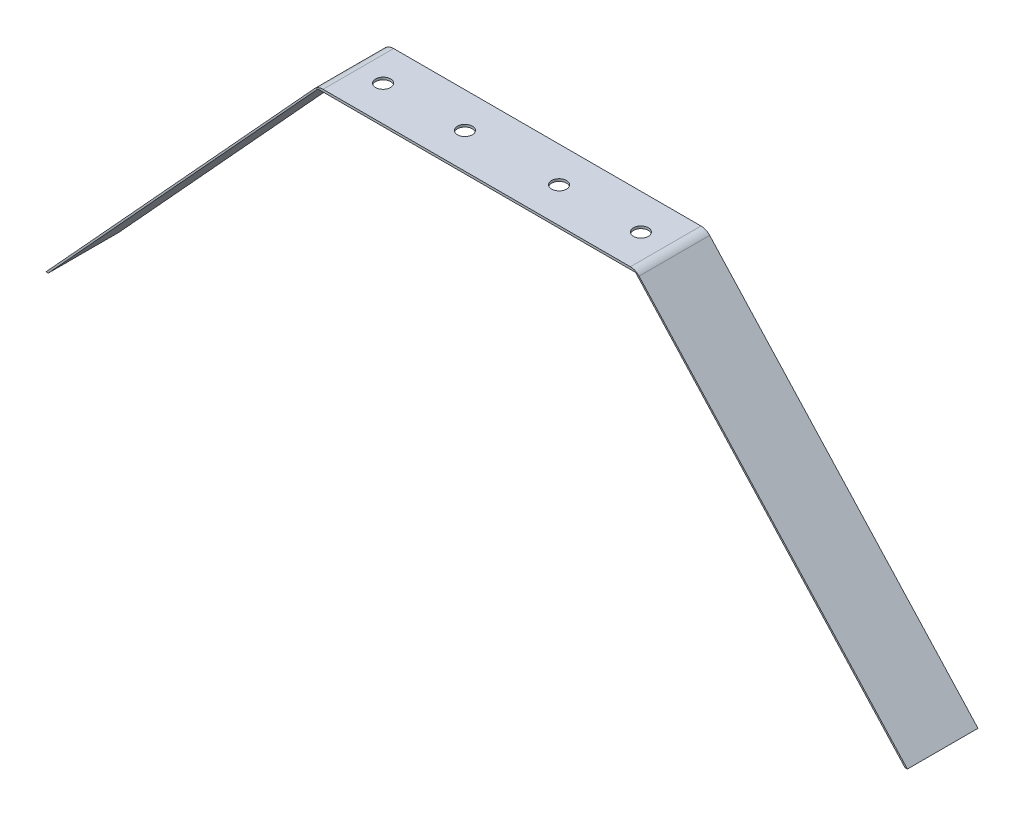
ISO-10303-21;
HEADER;
FILE_DESCRIPTION(('STEP AP214'),'2;1');
FILE_NAME('part.step','',(''),(''),'','','');
FILE_SCHEMA(('AUTOMOTIVE_DESIGN { 1 0 10303 214 1 1 1 1 }'));
ENDSEC;
DATA;
#1=APPLICATION_CONTEXT('core data for automotive mechanical design processes');
#2=APPLICATION_PROTOCOL_DEFINITION('international standard','automotive_design',2000,#1);
#3=PRODUCT_CONTEXT('',#1,'mechanical');
#4=PRODUCT('Part','Part','',(#3));
#5=PRODUCT_RELATED_PRODUCT_CATEGORY('part','',(#4));
#6=PRODUCT_DEFINITION_FORMATION('','',#4);
#7=PRODUCT_DEFINITION_CONTEXT('part definition',#1,'design');
#8=PRODUCT_DEFINITION('design','',#6,#7);
#9=PRODUCT_DEFINITION_SHAPE('','',#8);
#10=(LENGTH_UNIT() NAMED_UNIT(*) SI_UNIT(.MILLI.,.METRE.));
#11=(NAMED_UNIT(*) PLANE_ANGLE_UNIT() SI_UNIT($,.RADIAN.));
#12=(NAMED_UNIT(*) SI_UNIT($,.STERADIAN.) SOLID_ANGLE_UNIT());
#13=UNCERTAINTY_MEASURE_WITH_UNIT(LENGTH_MEASURE(1.E-05),#10,'distance_accuracy_value','');
#14=(GEOMETRIC_REPRESENTATION_CONTEXT(3) GLOBAL_UNCERTAINTY_ASSIGNED_CONTEXT((#13)) GLOBAL_UNIT_ASSIGNED_CONTEXT((#10,
#11,#12)) REPRESENTATION_CONTEXT('',''));
#15=CARTESIAN_POINT('',(0.,0.,0.));
#16=DIRECTION('',(0.,0.,1.));
#17=DIRECTION('',(1.,0.,0.));
#18=AXIS2_PLACEMENT_3D('',#15,#16,#17);
#19=CARTESIAN_POINT('',(-205.,97.5,30.));
#20=DIRECTION('',(0.,-1.,0.));
#21=DIRECTION('',(0.,0.,-1.));
#22=AXIS2_PLACEMENT_3D('',#19,#20,#21);
#23=PLANE('',#22);
#24=CARTESIAN_POINT('',(-54.768749878,97.5,15.));
#25=DIRECTION('',(0.,1.,0.));
#26=DIRECTION('',(0.,0.,1.));
#27=AXIS2_PLACEMENT_3D('',#24,#25,#26);
#28=CIRCLE('',#27,3.175);
#29=CARTESIAN_POINT('',(-54.768749878,97.5,18.175));
#30=VERTEX_POINT('',#29);
#31=EDGE_CURVE('E210',#30,#30,#28,.T.);
#32=ORIENTED_EDGE('',*,*,#31,.F.);
#33=EDGE_LOOP('',(#32));
#34=FACE_BOUND('',#33,.T.);
#35=CARTESIAN_POINT('',(54.768750122,97.5,15.));
#36=DIRECTION('',(0.,1.,0.));
#37=DIRECTION('',(0.,0.,1.));
#38=AXIS2_PLACEMENT_3D('',#35,#36,#37);
#39=CIRCLE('',#38,3.17499999999998);
#40=CARTESIAN_POINT('',(54.768750122,97.5,18.175));
#41=VERTEX_POINT('',#40);
#42=EDGE_CURVE('E213',#41,#41,#39,.T.);
#43=ORIENTED_EDGE('',*,*,#42,.F.);
#44=EDGE_LOOP('',(#43));
#45=FACE_BOUND('',#44,.T.);
#46=CARTESIAN_POINT('',(20.,97.5,15.));
#47=DIRECTION('',(0.,1.,0.));
#48=DIRECTION('',(0.,0.,1.));
#49=AXIS2_PLACEMENT_3D('',#46,#47,#48);
#50=CIRCLE('',#49,3.17499999999998);
#51=CARTESIAN_POINT('',(20.,97.5,18.175));
#52=VERTEX_POINT('',#51);
#53=EDGE_CURVE('E209',#52,#52,#50,.T.);
#54=ORIENTED_EDGE('',*,*,#53,.F.);
#55=EDGE_LOOP('',(#54));
#56=FACE_BOUND('',#55,.T.);
#57=CARTESIAN_POINT('',(-20.,97.5,15.));
#58=DIRECTION('',(0.,1.,0.));
#59=DIRECTION('',(0.,0.,1.));
#60=AXIS2_PLACEMENT_3D('',#57,#58,#59);
#61=CIRCLE('',#60,3.175);
#62=CARTESIAN_POINT('',(-20.,97.5,18.175));
#63=VERTEX_POINT('',#62);
#64=EDGE_CURVE('E170',#63,#63,#61,.T.);
#65=ORIENTED_EDGE('',*,*,#64,.F.);
#66=EDGE_LOOP('',(#65));
#67=FACE_BOUND('',#66,.T.);
#68=DIRECTION('',(-1.,0.,0.));
#69=VECTOR('',#68,1.);
#70=CARTESIAN_POINT('',(-205.,97.5,30.));
#71=LINE('',#70,#69);
#72=CARTESIAN_POINT('',(65.3004914182918,97.5,30.));
#73=VERTEX_POINT('',#72);
#74=CARTESIAN_POINT('',(-65.3004914182918,97.5,30.));
#75=VERTEX_POINT('',#74);
#76=EDGE_CURVE('E145',#73,#75,#71,.T.);
#77=ORIENTED_EDGE('',*,*,#76,.F.);
#78=DIRECTION('',(0.,0.,1.));
#79=VECTOR('',#78,1.);
#80=CARTESIAN_POINT('',(65.3004914182918,97.5,0.));
#81=LINE('',#80,#79);
#82=CARTESIAN_POINT('',(65.3004914182918,97.5,0.));
#83=VERTEX_POINT('',#82);
#84=EDGE_CURVE('E162',#73,#83,#81,.F.);
#85=ORIENTED_EDGE('',*,*,#84,.T.);
#86=DIRECTION('',(-1.,0.,0.));
#87=VECTOR('',#86,1.);
#88=CARTESIAN_POINT('',(-205.,97.5,0.));
#89=LINE('',#88,#87);
#90=CARTESIAN_POINT('',(-65.3004914182918,97.5,0.));
#91=VERTEX_POINT('',#90);
#92=EDGE_CURVE('E137',#83,#91,#89,.T.);
#93=ORIENTED_EDGE('',*,*,#92,.T.);
#94=DIRECTION('',(0.,0.,1.));
#95=VECTOR('',#94,1.);
#96=CARTESIAN_POINT('',(-65.3004914182918,97.5,30.));
#97=LINE('',#96,#95);
#98=EDGE_CURVE('E147',#91,#75,#97,.T.);
#99=ORIENTED_EDGE('',*,*,#98,.T.);
#100=EDGE_LOOP('',(#77,#85,#93,#99));
#101=FACE_BOUND('',#100,.T.);
#102=ADVANCED_FACE('F38',(#34,#45,#56,#67,#101),#23,.F.);
#103=CARTESIAN_POINT('',(0.,0.,30.));
#104=DIRECTION('',(0.,0.,1.));
#105=DIRECTION('',(1.,0.,0.));
#106=AXIS2_PLACEMENT_3D('',#103,#104,#105);
#107=PLANE('',#106);
#108=DIRECTION('',(1.,0.,0.));
#109=VECTOR('',#108,1.);
#110=CARTESIAN_POINT('',(-210.,-28.5,30.));
#111=LINE('',#110,#109);
#112=CARTESIAN_POINT('',(182.013422818792,-28.5,30.));
#113=VERTEX_POINT('',#112);
#114=CARTESIAN_POINT('',(183.,-28.5,30.));
#115=VERTEX_POINT('',#114);
#116=EDGE_CURVE('E61',#113,#115,#111,.T.);
#117=ORIENTED_EDGE('',*,*,#116,.T.);
#118=DIRECTION('',(-0.675724628517346,0.737154140200742,0.));
#119=VECTOR('',#118,1.);
#120=CARTESIAN_POINT('',(85.245283018868,78.1415094339622,30.));
#121=LINE('',#120,#119);
#122=CARTESIAN_POINT('',(68.9862621192955,95.8786231425867,30.));
#123=VERTEX_POINT('',#122);
#124=EDGE_CURVE('E139',#115,#123,#121,.T.);
#125=ORIENTED_EDGE('',*,*,#124,.T.);
#126=CARTESIAN_POINT('',(65.3004914182918,92.5,30.));
#127=DIRECTION('',(0.,0.,1.));
#128=DIRECTION('',(1.,0.,0.));
#129=AXIS2_PLACEMENT_3D('',#126,#127,#128);
#130=CIRCLE('',#129,5.);
#131=EDGE_CURVE('E160',#123,#73,#130,.T.);
#132=ORIENTED_EDGE('',*,*,#131,.T.);
#133=ORIENTED_EDGE('',*,*,#76,.T.);
#134=CARTESIAN_POINT('',(-65.3004914182918,92.5,30.));
#135=DIRECTION('',(0.,0.,1.));
#136=DIRECTION('',(1.,0.,0.));
#137=AXIS2_PLACEMENT_3D('',#134,#135,#136);
#138=CIRCLE('',#137,5.);
#139=CARTESIAN_POINT('',(-68.9862621192955,95.8786231425867,30.));
#140=VERTEX_POINT('',#139);
#141=EDGE_CURVE('E133',#75,#140,#138,.T.);
#142=ORIENTED_EDGE('',*,*,#141,.T.);
#143=DIRECTION('',(0.675724628517346,0.737154140200742,0.));
#144=VECTOR('',#143,1.);
#145=CARTESIAN_POINT('',(-85.2452830188679,78.1415094339623,30.));
#146=LINE('',#145,#144);
#147=CARTESIAN_POINT('',(-183.,-28.5,30.));
#148=VERTEX_POINT('',#147);
#149=EDGE_CURVE('E126',#148,#140,#146,.T.);
#150=ORIENTED_EDGE('',*,*,#149,.F.);
#151=CARTESIAN_POINT('',(-182.013422818792,-28.5,30.));
#152=VERTEX_POINT('',#151);
#153=EDGE_CURVE('E112',#148,#152,#111,.T.);
#154=ORIENTED_EDGE('',*,*,#153,.T.);
#155=DIRECTION('',(0.675500504238443,0.737359524773099,0.));
#156=VECTOR('',#155,1.);
#157=CARTESIAN_POINT('',(-84.7650566633809,77.6538941916208,30.));
#158=LINE('',#157,#156);
#159=CARTESIAN_POINT('',(-67.5,96.5,30.));
#160=VERTEX_POINT('',#159);
#161=EDGE_CURVE('E187',#152,#160,#158,.T.);
#162=ORIENTED_EDGE('',*,*,#161,.T.);
#163=DIRECTION('',(1.,0.,0.));
#164=VECTOR('',#163,1.);
#165=CARTESIAN_POINT('',(0.,96.5,30.));
#166=LINE('',#165,#164);
#167=CARTESIAN_POINT('',(67.5,96.5,30.));
#168=VERTEX_POINT('',#167);
#169=EDGE_CURVE('E180',#160,#168,#166,.T.);
#170=ORIENTED_EDGE('',*,*,#169,.T.);
#171=DIRECTION('',(-0.675500504238443,0.737359524773099,0.));
#172=VECTOR('',#171,1.);
#173=CARTESIAN_POINT('',(84.7650566633809,77.6538941916208,30.));
#174=LINE('',#173,#172);
#175=EDGE_CURVE('E177',#113,#168,#174,.T.);
#176=ORIENTED_EDGE('',*,*,#175,.F.);
#177=EDGE_LOOP('',(#117,#125,#132,#133,#142,#150,#154,#162,#170,#176));
#178=FACE_BOUND('',#177,.T.);
#179=ADVANCED_FACE('F131',(#178),#107,.T.);
#180=CARTESIAN_POINT('',(0.,0.,0.));
#181=DIRECTION('',(0.,0.,1.));
#182=DIRECTION('',(1.,0.,0.));
#183=AXIS2_PLACEMENT_3D('',#180,#181,#182);
#184=PLANE('',#183);
#185=DIRECTION('',(-0.675724628517346,0.737154140200742,0.));
#186=VECTOR('',#185,1.);
#187=CARTESIAN_POINT('',(85.245283018868,78.1415094339622,0.));
#188=LINE('',#187,#186);
#189=CARTESIAN_POINT('',(183.,-28.5,0.));
#190=VERTEX_POINT('',#189);
#191=CARTESIAN_POINT('',(68.9862621192955,95.8786231425867,0.));
#192=VERTEX_POINT('',#191);
#193=EDGE_CURVE('E135',#190,#192,#188,.T.);
#194=ORIENTED_EDGE('',*,*,#193,.F.);
#195=DIRECTION('',(1.,0.,0.));
#196=VECTOR('',#195,1.);
#197=CARTESIAN_POINT('',(-210.,-28.5,0.));
#198=LINE('',#197,#196);
#199=CARTESIAN_POINT('',(182.013422818792,-28.5,0.));
#200=VERTEX_POINT('',#199);
#201=EDGE_CURVE('E120',#200,#190,#198,.T.);
#202=ORIENTED_EDGE('',*,*,#201,.F.);
#203=DIRECTION('',(-0.675500504238443,0.737359524773099,0.));
#204=VECTOR('',#203,1.);
#205=CARTESIAN_POINT('',(84.7650566633809,77.6538941916208,0.));
#206=LINE('',#205,#204);
#207=CARTESIAN_POINT('',(67.5,96.5,0.));
#208=VERTEX_POINT('',#207);
#209=EDGE_CURVE('E194',#200,#208,#206,.T.);
#210=ORIENTED_EDGE('',*,*,#209,.T.);
#211=DIRECTION('',(1.,0.,0.));
#212=VECTOR('',#211,1.);
#213=CARTESIAN_POINT('',(0.,96.5,0.));
#214=LINE('',#213,#212);
#215=CARTESIAN_POINT('',(-67.5,96.5,0.));
#216=VERTEX_POINT('',#215);
#217=EDGE_CURVE('E200',#216,#208,#214,.T.);
#218=ORIENTED_EDGE('',*,*,#217,.F.);
#219=DIRECTION('',(0.675500504238443,0.737359524773099,0.));
#220=VECTOR('',#219,1.);
#221=CARTESIAN_POINT('',(-84.7650566633809,77.6538941916208,0.));
#222=LINE('',#221,#220);
#223=CARTESIAN_POINT('',(-182.013422818792,-28.5,0.));
#224=VERTEX_POINT('',#223);
#225=EDGE_CURVE('E190',#224,#216,#222,.T.);
#226=ORIENTED_EDGE('',*,*,#225,.F.);
#227=CARTESIAN_POINT('',(-183.,-28.5,0.));
#228=VERTEX_POINT('',#227);
#229=EDGE_CURVE('E53',#228,#224,#198,.T.);
#230=ORIENTED_EDGE('',*,*,#229,.F.);
#231=DIRECTION('',(0.675724628517346,0.737154140200742,0.));
#232=VECTOR('',#231,1.);
#233=CARTESIAN_POINT('',(-85.2452830188679,78.1415094339623,0.));
#234=LINE('',#233,#232);
#235=CARTESIAN_POINT('',(-68.9862621192955,95.8786231425867,0.));
#236=VERTEX_POINT('',#235);
#237=EDGE_CURVE('E128',#228,#236,#234,.T.);
#238=ORIENTED_EDGE('',*,*,#237,.T.);
#239=CARTESIAN_POINT('',(-65.3004914182918,92.5,0.));
#240=DIRECTION('',(0.,0.,1.));
#241=DIRECTION('',(1.,0.,0.));
#242=AXIS2_PLACEMENT_3D('',#239,#240,#241);
#243=CIRCLE('',#242,5.);
#244=EDGE_CURVE('E154',#236,#91,#243,.F.);
#245=ORIENTED_EDGE('',*,*,#244,.T.);
#246=ORIENTED_EDGE('',*,*,#92,.F.);
#247=CARTESIAN_POINT('',(65.3004914182918,92.5,0.));
#248=DIRECTION('',(0.,0.,1.));
#249=DIRECTION('',(1.,0.,0.));
#250=AXIS2_PLACEMENT_3D('',#247,#248,#249);
#251=CIRCLE('',#250,5.);
#252=EDGE_CURVE('E46',#83,#192,#251,.F.);
#253=ORIENTED_EDGE('',*,*,#252,.T.);
#254=EDGE_LOOP('',(#194,#202,#210,#218,#226,#230,#238,#245,#246,#253));
#255=FACE_BOUND('',#254,.T.);
#256=ADVANCED_FACE('F229',(#255),#184,.F.);
#257=CARTESIAN_POINT('',(85.245283018868,78.1415094339622,0.));
#258=DIRECTION('',(0.737154140200742,0.675724628517346,0.));
#259=DIRECTION('',(-0.675724628517346,0.737154140200742,0.));
#260=AXIS2_PLACEMENT_3D('',#257,#258,#259);
#261=PLANE('',#260);
#262=DIRECTION('',(0.,0.,1.));
#263=VECTOR('',#262,1.);
#264=CARTESIAN_POINT('',(183.,-28.5,0.));
#265=LINE('',#264,#263);
#266=EDGE_CURVE('E129',#190,#115,#265,.T.);
#267=ORIENTED_EDGE('',*,*,#266,.F.);
#268=ORIENTED_EDGE('',*,*,#193,.T.);
#269=DIRECTION('',(0.,0.,1.));
#270=VECTOR('',#269,1.);
#271=CARTESIAN_POINT('',(68.9862621192955,95.8786231425867,30.));
#272=LINE('',#271,#270);
#273=EDGE_CURVE('E157',#192,#123,#272,.T.);
#274=ORIENTED_EDGE('',*,*,#273,.T.);
#275=ORIENTED_EDGE('',*,*,#124,.F.);
#276=EDGE_LOOP('',(#267,#268,#274,#275));
#277=FACE_BOUND('',#276,.T.);
#278=ADVANCED_FACE('F228',(#277),#261,.T.);
#279=CARTESIAN_POINT('',(-85.2452830188679,78.1415094339623,0.));
#280=DIRECTION('',(0.737154140200741,-0.675724628517346,0.));
#281=DIRECTION('',(0.675724628517346,0.737154140200742,0.));
#282=AXIS2_PLACEMENT_3D('',#279,#280,#281);
#283=PLANE('',#282);
#284=ORIENTED_EDGE('',*,*,#237,.F.);
#285=DIRECTION('',(0.,0.,1.));
#286=VECTOR('',#285,1.);
#287=CARTESIAN_POINT('',(-183.,-28.5,0.));
#288=LINE('',#287,#286);
#289=EDGE_CURVE('E115',#228,#148,#288,.T.);
#290=ORIENTED_EDGE('',*,*,#289,.T.);
#291=ORIENTED_EDGE('',*,*,#149,.T.);
#292=DIRECTION('',(0.,0.,1.));
#293=VECTOR('',#292,1.);
#294=CARTESIAN_POINT('',(-68.9862621192955,95.8786231425867,0.));
#295=LINE('',#294,#293);
#296=EDGE_CURVE('E152',#140,#236,#295,.F.);
#297=ORIENTED_EDGE('',*,*,#296,.T.);
#298=EDGE_LOOP('',(#284,#290,#291,#297));
#299=FACE_BOUND('',#298,.T.);
#300=ADVANCED_FACE('F124',(#299),#283,.F.);
#301=CARTESIAN_POINT('',(-84.7650566633809,77.6538941916208,0.));
#302=DIRECTION('',(0.737359524773099,-0.675500504238443,0.));
#303=DIRECTION('',(0.675500504238443,0.737359524773099,0.));
#304=AXIS2_PLACEMENT_3D('',#301,#302,#303);
#305=PLANE('',#304);
#306=DIRECTION('',(0.,0.,1.));
#307=VECTOR('',#306,1.);
#308=CARTESIAN_POINT('',(-182.013422818792,-28.5,0.));
#309=LINE('',#308,#307);
#310=EDGE_CURVE('E116',#224,#152,#309,.T.);
#311=ORIENTED_EDGE('',*,*,#310,.F.);
#312=ORIENTED_EDGE('',*,*,#225,.T.);
#313=DIRECTION('',(0.,0.,1.));
#314=VECTOR('',#313,1.);
#315=CARTESIAN_POINT('',(-67.5,96.5,0.));
#316=LINE('',#315,#314);
#317=EDGE_CURVE('E144',#216,#160,#316,.T.);
#318=ORIENTED_EDGE('',*,*,#317,.T.);
#319=ORIENTED_EDGE('',*,*,#161,.F.);
#320=EDGE_LOOP('',(#311,#312,#318,#319));
#321=FACE_BOUND('',#320,.T.);
#322=ADVANCED_FACE('F244',(#321),#305,.T.);
#323=CARTESIAN_POINT('',(0.,96.5,0.));
#324=DIRECTION('',(0.,-1.,0.));
#325=DIRECTION('',(0.,0.,-1.));
#326=AXIS2_PLACEMENT_3D('',#323,#324,#325);
#327=PLANE('',#326);
#328=CARTESIAN_POINT('',(-54.768749878,96.5,15.));
#329=DIRECTION('',(0.,-1.,0.));
#330=DIRECTION('',(0.,0.,-1.));
#331=AXIS2_PLACEMENT_3D('',#328,#329,#330);
#332=CIRCLE('',#331,3.175);
#333=CARTESIAN_POINT('',(-54.768749878,96.5,11.825));
#334=VERTEX_POINT('',#333);
#335=EDGE_CURVE('E175',#334,#334,#332,.T.);
#336=ORIENTED_EDGE('',*,*,#335,.F.);
#337=EDGE_LOOP('',(#336));
#338=FACE_BOUND('',#337,.T.);
#339=CARTESIAN_POINT('',(54.768750122,96.5,15.));
#340=DIRECTION('',(0.,-1.,0.));
#341=DIRECTION('',(0.,0.,-1.));
#342=AXIS2_PLACEMENT_3D('',#339,#340,#341);
#343=CIRCLE('',#342,3.17499999999998);
#344=CARTESIAN_POINT('',(54.768750122,96.5,11.825));
#345=VERTEX_POINT('',#344);
#346=EDGE_CURVE('E173',#345,#345,#343,.T.);
#347=ORIENTED_EDGE('',*,*,#346,.F.);
#348=EDGE_LOOP('',(#347));
#349=FACE_BOUND('',#348,.T.);
#350=CARTESIAN_POINT('',(20.,96.5,15.));
#351=DIRECTION('',(0.,-1.,0.));
#352=DIRECTION('',(0.,0.,-1.));
#353=AXIS2_PLACEMENT_3D('',#350,#351,#352);
#354=CIRCLE('',#353,3.17499999999998);
#355=CARTESIAN_POINT('',(20.,96.5,11.825));
#356=VERTEX_POINT('',#355);
#357=EDGE_CURVE('E169',#356,#356,#354,.T.);
#358=ORIENTED_EDGE('',*,*,#357,.F.);
#359=EDGE_LOOP('',(#358));
#360=FACE_BOUND('',#359,.T.);
#361=CARTESIAN_POINT('',(-20.,96.5,15.));
#362=DIRECTION('',(0.,-1.,0.));
#363=DIRECTION('',(0.,0.,-1.));
#364=AXIS2_PLACEMENT_3D('',#361,#362,#363);
#365=CIRCLE('',#364,3.175);
#366=CARTESIAN_POINT('',(-20.,96.5,11.825));
#367=VERTEX_POINT('',#366);
#368=EDGE_CURVE('E166',#367,#367,#365,.T.);
#369=ORIENTED_EDGE('',*,*,#368,.F.);
#370=EDGE_LOOP('',(#369));
#371=FACE_BOUND('',#370,.T.);
#372=ORIENTED_EDGE('',*,*,#169,.F.);
#373=ORIENTED_EDGE('',*,*,#317,.F.);
#374=ORIENTED_EDGE('',*,*,#217,.T.);
#375=DIRECTION('',(0.,0.,1.));
#376=VECTOR('',#375,1.);
#377=CARTESIAN_POINT('',(67.5,96.5,0.));
#378=LINE('',#377,#376);
#379=EDGE_CURVE('E196',#208,#168,#378,.T.);
#380=ORIENTED_EDGE('',*,*,#379,.T.);
#381=EDGE_LOOP('',(#372,#373,#374,#380));
#382=FACE_BOUND('',#381,.T.);
#383=ADVANCED_FACE('F243',(#338,#349,#360,#371,#382),#327,.T.);
#384=CARTESIAN_POINT('',(84.7650566633809,77.6538941916208,0.));
#385=DIRECTION('',(0.737359524773099,0.675500504238442,0.));
#386=DIRECTION('',(-0.675500504238443,0.737359524773099,0.));
#387=AXIS2_PLACEMENT_3D('',#384,#385,#386);
#388=PLANE('',#387);
#389=ORIENTED_EDGE('',*,*,#209,.F.);
#390=DIRECTION('',(0.,0.,1.));
#391=VECTOR('',#390,1.);
#392=CARTESIAN_POINT('',(182.013422818792,-28.5,0.));
#393=LINE('',#392,#391);
#394=EDGE_CURVE('E11',#200,#113,#393,.T.);
#395=ORIENTED_EDGE('',*,*,#394,.T.);
#396=ORIENTED_EDGE('',*,*,#175,.T.);
#397=ORIENTED_EDGE('',*,*,#379,.F.);
#398=EDGE_LOOP('',(#389,#395,#396,#397));
#399=FACE_BOUND('',#398,.T.);
#400=ADVANCED_FACE('F242',(#399),#388,.F.);
#401=CARTESIAN_POINT('',(-65.3004914182918,92.5,30.));
#402=DIRECTION('',(0.,0.,1.));
#403=DIRECTION('',(1.,0.,0.));
#404=AXIS2_PLACEMENT_3D('',#401,#402,#403);
#405=CYLINDRICAL_SURFACE('',#404,5.);
#406=ORIENTED_EDGE('',*,*,#244,.F.);
#407=ORIENTED_EDGE('',*,*,#296,.F.);
#408=ORIENTED_EDGE('',*,*,#141,.F.);
#409=ORIENTED_EDGE('',*,*,#98,.F.);
#410=EDGE_LOOP('',(#406,#407,#408,#409));
#411=FACE_BOUND('',#410,.T.);
#412=ADVANCED_FACE('F241',(#411),#405,.T.);
#413=CARTESIAN_POINT('',(65.3004914182918,92.5,0.));
#414=DIRECTION('',(0.,0.,-1.));
#415=DIRECTION('',(-1.,0.,0.));
#416=AXIS2_PLACEMENT_3D('',#413,#414,#415);
#417=CYLINDRICAL_SURFACE('',#416,5.);
#418=ORIENTED_EDGE('',*,*,#252,.F.);
#419=ORIENTED_EDGE('',*,*,#84,.F.);
#420=ORIENTED_EDGE('',*,*,#131,.F.);
#421=ORIENTED_EDGE('',*,*,#273,.F.);
#422=EDGE_LOOP('',(#418,#419,#420,#421));
#423=FACE_BOUND('',#422,.T.);
#424=ADVANCED_FACE('F40',(#423),#417,.T.);
#425=CARTESIAN_POINT('',(-20.,87.5,15.));
#426=DIRECTION('',(0.,1.,0.));
#427=DIRECTION('',(0.,0.,1.));
#428=AXIS2_PLACEMENT_3D('',#425,#426,#427);
#429=CYLINDRICAL_SURFACE('',#428,3.175);
#430=ORIENTED_EDGE('',*,*,#368,.T.);
#431=EDGE_LOOP('',(#430));
#432=FACE_BOUND('',#431,.T.);
#433=ORIENTED_EDGE('',*,*,#64,.T.);
#434=EDGE_LOOP('',(#433));
#435=FACE_BOUND('',#434,.T.);
#436=ADVANCED_FACE('F270',(#432,#435),#429,.F.);
#437=CARTESIAN_POINT('',(20.,87.5,15.));
#438=DIRECTION('',(0.,1.,0.));
#439=DIRECTION('',(0.,0.,1.));
#440=AXIS2_PLACEMENT_3D('',#437,#438,#439);
#441=CYLINDRICAL_SURFACE('',#440,3.17499999999998);
#442=ORIENTED_EDGE('',*,*,#357,.T.);
#443=EDGE_LOOP('',(#442));
#444=FACE_BOUND('',#443,.T.);
#445=ORIENTED_EDGE('',*,*,#53,.T.);
#446=EDGE_LOOP('',(#445));
#447=FACE_BOUND('',#446,.T.);
#448=ADVANCED_FACE('F307',(#444,#447),#441,.F.);
#449=CARTESIAN_POINT('',(54.768750122,87.5,15.));
#450=DIRECTION('',(0.,1.,0.));
#451=DIRECTION('',(0.,0.,1.));
#452=AXIS2_PLACEMENT_3D('',#449,#450,#451);
#453=CYLINDRICAL_SURFACE('',#452,3.17499999999998);
#454=ORIENTED_EDGE('',*,*,#346,.T.);
#455=EDGE_LOOP('',(#454));
#456=FACE_BOUND('',#455,.T.);
#457=ORIENTED_EDGE('',*,*,#42,.T.);
#458=EDGE_LOOP('',(#457));
#459=FACE_BOUND('',#458,.T.);
#460=ADVANCED_FACE('F296',(#456,#459),#453,.F.);
#461=CARTESIAN_POINT('',(-54.768749878,87.5,15.));
#462=DIRECTION('',(0.,1.,0.));
#463=DIRECTION('',(0.,0.,1.));
#464=AXIS2_PLACEMENT_3D('',#461,#462,#463);
#465=CYLINDRICAL_SURFACE('',#464,3.175);
#466=ORIENTED_EDGE('',*,*,#335,.T.);
#467=EDGE_LOOP('',(#466));
#468=FACE_BOUND('',#467,.T.);
#469=ORIENTED_EDGE('',*,*,#31,.T.);
#470=EDGE_LOOP('',(#469));
#471=FACE_BOUND('',#470,.T.);
#472=ADVANCED_FACE('F291',(#468,#471),#465,.F.);
#473=CARTESIAN_POINT('',(-210.,-28.5,30.));
#474=DIRECTION('',(0.,1.,0.));
#475=DIRECTION('',(0.,0.,1.));
#476=AXIS2_PLACEMENT_3D('',#473,#474,#475);
#477=PLANE('',#476);
#478=ORIENTED_EDGE('',*,*,#266,.T.);
#479=ORIENTED_EDGE('',*,*,#116,.F.);
#480=ORIENTED_EDGE('',*,*,#394,.F.);
#481=ORIENTED_EDGE('',*,*,#201,.T.);
#482=EDGE_LOOP('',(#478,#479,#480,#481));
#483=FACE_BOUND('',#482,.T.);
#484=ADVANCED_FACE('F222',(#483),#477,.F.);
#485=ORIENTED_EDGE('',*,*,#229,.T.);
#486=ORIENTED_EDGE('',*,*,#310,.T.);
#487=ORIENTED_EDGE('',*,*,#153,.F.);
#488=ORIENTED_EDGE('',*,*,#289,.F.);
#489=EDGE_LOOP('',(#485,#486,#487,#488));
#490=FACE_BOUND('',#489,.T.);
#491=ADVANCED_FACE('F114',(#490),#477,.F.);
#492=CLOSED_SHELL('',(#102,#179,#256,#278,#300,#322,#383,#400,#412,#424,#436,#448,#460,#472,
#484,#491));
#493=MANIFOLD_SOLID_BREP('B2',#492);
#494=ADVANCED_BREP_SHAPE_REPRESENTATION('',(#18,#493),#14);
#495=SHAPE_DEFINITION_REPRESENTATION(#9,#494);
ENDSEC;
END-ISO-10303-21;
